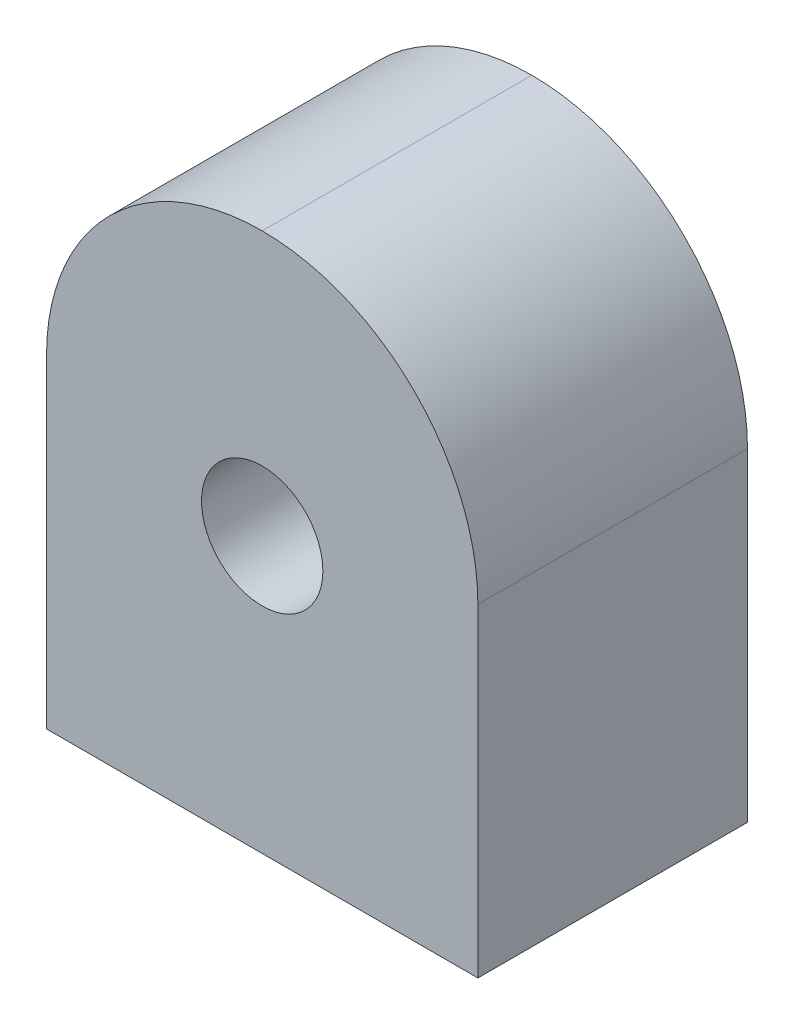
ISO-10303-21;
HEADER;
FILE_DESCRIPTION(('STEP AP214'),'2;1');
FILE_NAME('part.step','',(''),(''),'','','');
FILE_SCHEMA(('AUTOMOTIVE_DESIGN { 1 0 10303 214 1 1 1 1 }'));
ENDSEC;
DATA;
#1=APPLICATION_CONTEXT('core data for automotive mechanical design processes');
#2=APPLICATION_PROTOCOL_DEFINITION('international standard','automotive_design',2000,#1);
#3=PRODUCT_CONTEXT('',#1,'mechanical');
#4=PRODUCT('Part','Part','',(#3));
#5=PRODUCT_RELATED_PRODUCT_CATEGORY('part','',(#4));
#6=PRODUCT_DEFINITION_FORMATION('','',#4);
#7=PRODUCT_DEFINITION_CONTEXT('part definition',#1,'design');
#8=PRODUCT_DEFINITION('design','',#6,#7);
#9=PRODUCT_DEFINITION_SHAPE('','',#8);
#10=(LENGTH_UNIT() NAMED_UNIT(*) SI_UNIT(.MILLI.,.METRE.));
#11=(NAMED_UNIT(*) PLANE_ANGLE_UNIT() SI_UNIT($,.RADIAN.));
#12=(NAMED_UNIT(*) SI_UNIT($,.STERADIAN.) SOLID_ANGLE_UNIT());
#13=UNCERTAINTY_MEASURE_WITH_UNIT(LENGTH_MEASURE(1.E-05),#10,'distance_accuracy_value','');
#14=(GEOMETRIC_REPRESENTATION_CONTEXT(3) GLOBAL_UNCERTAINTY_ASSIGNED_CONTEXT((#13)) GLOBAL_UNIT_ASSIGNED_CONTEXT((#10,
#11,#12)) REPRESENTATION_CONTEXT('',''));
#15=CARTESIAN_POINT('',(0.,0.,0.));
#16=DIRECTION('',(0.,0.,1.));
#17=DIRECTION('',(1.,0.,0.));
#18=AXIS2_PLACEMENT_3D('',#15,#16,#17);
#19=CARTESIAN_POINT('',(0.,0.,10.));
#20=DIRECTION('',(1.,0.,0.));
#21=DIRECTION('',(0.,0.,-1.));
#22=AXIS2_PLACEMENT_3D('',#19,#20,#21);
#23=PLANE('',#22);
#24=DIRECTION('',(0.,-1.,0.));
#25=VECTOR('',#24,1.);
#26=CARTESIAN_POINT('',(0.,0.,10.));
#27=LINE('',#26,#25);
#28=CARTESIAN_POINT('',(0.,12.,10.));
#29=VERTEX_POINT('',#28);
#30=CARTESIAN_POINT('',(0.,0.,10.));
#31=VERTEX_POINT('',#30);
#32=EDGE_CURVE('E82',#29,#31,#27,.T.);
#33=ORIENTED_EDGE('',*,*,#32,.F.);
#34=DIRECTION('',(0.,0.,-1.));
#35=VECTOR('',#34,1.);
#36=CARTESIAN_POINT('',(0.,12.,10.));
#37=LINE('',#36,#35);
#38=CARTESIAN_POINT('',(0.,12.,0.));
#39=VERTEX_POINT('',#38);
#40=EDGE_CURVE('E11',#29,#39,#37,.T.);
#41=ORIENTED_EDGE('',*,*,#40,.T.);
#42=DIRECTION('',(0.,-1.,0.));
#43=VECTOR('',#42,1.);
#44=CARTESIAN_POINT('',(0.,0.,0.));
#45=LINE('',#44,#43);
#46=CARTESIAN_POINT('',(0.,0.,0.));
#47=VERTEX_POINT('',#46);
#48=EDGE_CURVE('E102',#39,#47,#45,.T.);
#49=ORIENTED_EDGE('',*,*,#48,.T.);
#50=DIRECTION('',(0.,0.,-1.));
#51=VECTOR('',#50,1.);
#52=CARTESIAN_POINT('',(0.,0.,10.));
#53=LINE('',#52,#51);
#54=EDGE_CURVE('E95',#31,#47,#53,.T.);
#55=ORIENTED_EDGE('',*,*,#54,.F.);
#56=EDGE_LOOP('',(#33,#41,#49,#55));
#57=FACE_BOUND('',#56,.T.);
#58=ADVANCED_FACE('F41',(#57),#23,.F.);
#59=CARTESIAN_POINT('',(0.,0.,10.));
#60=DIRECTION('',(0.,1.,0.));
#61=DIRECTION('',(0.,0.,1.));
#62=AXIS2_PLACEMENT_3D('',#59,#60,#61);
#63=PLANE('',#62);
#64=DIRECTION('',(1.,0.,0.));
#65=VECTOR('',#64,1.);
#66=CARTESIAN_POINT('',(0.,0.,0.));
#67=LINE('',#66,#65);
#68=CARTESIAN_POINT('',(16.,0.,0.));
#69=VERTEX_POINT('',#68);
#70=EDGE_CURVE('E126',#47,#69,#67,.T.);
#71=ORIENTED_EDGE('',*,*,#70,.T.);
#72=DIRECTION('',(0.,0.,-1.));
#73=VECTOR('',#72,1.);
#74=CARTESIAN_POINT('',(16.,0.,10.));
#75=LINE('',#74,#73);
#76=CARTESIAN_POINT('',(16.,0.,10.));
#77=VERTEX_POINT('',#76);
#78=EDGE_CURVE('E97',#77,#69,#75,.T.);
#79=ORIENTED_EDGE('',*,*,#78,.F.);
#80=DIRECTION('',(1.,0.,0.));
#81=VECTOR('',#80,1.);
#82=CARTESIAN_POINT('',(0.,0.,10.));
#83=LINE('',#82,#81);
#84=EDGE_CURVE('E85',#31,#77,#83,.T.);
#85=ORIENTED_EDGE('',*,*,#84,.F.);
#86=ORIENTED_EDGE('',*,*,#54,.T.);
#87=EDGE_LOOP('',(#71,#79,#85,#86));
#88=FACE_BOUND('',#87,.T.);
#89=ADVANCED_FACE('F94',(#88),#63,.F.);
#90=CARTESIAN_POINT('',(16.,0.,10.));
#91=DIRECTION('',(-1.,0.,0.));
#92=DIRECTION('',(0.,0.,1.));
#93=AXIS2_PLACEMENT_3D('',#90,#91,#92);
#94=PLANE('',#93);
#95=DIRECTION('',(0.,1.,0.));
#96=VECTOR('',#95,1.);
#97=CARTESIAN_POINT('',(16.,0.,0.));
#98=LINE('',#97,#96);
#99=CARTESIAN_POINT('',(16.,12.,0.));
#100=VERTEX_POINT('',#99);
#101=EDGE_CURVE('E90',#69,#100,#98,.T.);
#102=ORIENTED_EDGE('',*,*,#101,.T.);
#103=DIRECTION('',(0.,0.,-1.));
#104=VECTOR('',#103,1.);
#105=CARTESIAN_POINT('',(16.,12.,10.));
#106=LINE('',#105,#104);
#107=CARTESIAN_POINT('',(16.,12.,10.));
#108=VERTEX_POINT('',#107);
#109=EDGE_CURVE('E112',#100,#108,#106,.F.);
#110=ORIENTED_EDGE('',*,*,#109,.T.);
#111=DIRECTION('',(0.,1.,0.));
#112=VECTOR('',#111,1.);
#113=CARTESIAN_POINT('',(16.,0.,10.));
#114=LINE('',#113,#112);
#115=EDGE_CURVE('E99',#77,#108,#114,.T.);
#116=ORIENTED_EDGE('',*,*,#115,.F.);
#117=ORIENTED_EDGE('',*,*,#78,.T.);
#118=EDGE_LOOP('',(#102,#110,#116,#117));
#119=FACE_BOUND('',#118,.T.);
#120=ADVANCED_FACE('F119',(#119),#94,.F.);
#121=CARTESIAN_POINT('',(0.,0.,10.));
#122=DIRECTION('',(0.,0.,-1.));
#123=DIRECTION('',(-1.,0.,0.));
#124=AXIS2_PLACEMENT_3D('',#121,#122,#123);
#125=PLANE('',#124);
#126=CARTESIAN_POINT('',(8.,10.2,10.));
#127=DIRECTION('',(0.,0.,1.));
#128=DIRECTION('',(1.,0.,0.));
#129=AXIS2_PLACEMENT_3D('',#126,#127,#128);
#130=CIRCLE('',#129,2.25);
#131=CARTESIAN_POINT('',(10.25,10.2,10.));
#132=VERTEX_POINT('',#131);
#133=EDGE_CURVE('E135',#132,#132,#130,.T.);
#134=ORIENTED_EDGE('',*,*,#133,.F.);
#135=EDGE_LOOP('',(#134));
#136=FACE_BOUND('',#135,.T.);
#137=ORIENTED_EDGE('',*,*,#115,.T.);
#138=CARTESIAN_POINT('',(8.,12.,10.));
#139=DIRECTION('',(0.,0.,-1.));
#140=DIRECTION('',(-1.,0.,0.));
#141=AXIS2_PLACEMENT_3D('',#138,#139,#140);
#142=CIRCLE('',#141,8.);
#143=CARTESIAN_POINT('',(8.,20.,10.));
#144=VERTEX_POINT('',#143);
#145=EDGE_CURVE('E50',#108,#144,#142,.F.);
#146=ORIENTED_EDGE('',*,*,#145,.T.);
#147=CARTESIAN_POINT('',(8.,12.,10.));
#148=DIRECTION('',(0.,0.,-1.));
#149=DIRECTION('',(-1.,0.,0.));
#150=AXIS2_PLACEMENT_3D('',#147,#148,#149);
#151=CIRCLE('',#150,8.);
#152=EDGE_CURVE('E60',#144,#29,#151,.F.);
#153=ORIENTED_EDGE('',*,*,#152,.T.);
#154=ORIENTED_EDGE('',*,*,#32,.T.);
#155=ORIENTED_EDGE('',*,*,#84,.T.);
#156=EDGE_LOOP('',(#137,#146,#153,#154,#155));
#157=FACE_BOUND('',#156,.T.);
#158=ADVANCED_FACE('F84',(#136,#157),#125,.F.);
#159=CARTESIAN_POINT('',(0.,0.,0.));
#160=DIRECTION('',(0.,0.,-1.));
#161=DIRECTION('',(-1.,0.,0.));
#162=AXIS2_PLACEMENT_3D('',#159,#160,#161);
#163=PLANE('',#162);
#164=CARTESIAN_POINT('',(8.,10.2,0.));
#165=DIRECTION('',(0.,0.,1.));
#166=DIRECTION('',(1.,0.,0.));
#167=AXIS2_PLACEMENT_3D('',#164,#165,#166);
#168=CIRCLE('',#167,2.25);
#169=CARTESIAN_POINT('',(10.25,10.2,0.));
#170=VERTEX_POINT('',#169);
#171=EDGE_CURVE('E127',#170,#170,#168,.T.);
#172=ORIENTED_EDGE('',*,*,#171,.T.);
#173=EDGE_LOOP('',(#172));
#174=FACE_BOUND('',#173,.T.);
#175=CARTESIAN_POINT('',(8.,12.,0.));
#176=DIRECTION('',(0.,0.,-1.));
#177=DIRECTION('',(-1.,0.,0.));
#178=AXIS2_PLACEMENT_3D('',#175,#176,#177);
#179=CIRCLE('',#178,8.);
#180=CARTESIAN_POINT('',(8.,20.,0.));
#181=VERTEX_POINT('',#180);
#182=EDGE_CURVE('E104',#39,#181,#179,.T.);
#183=ORIENTED_EDGE('',*,*,#182,.T.);
#184=CARTESIAN_POINT('',(8.,12.,0.));
#185=DIRECTION('',(0.,0.,-1.));
#186=DIRECTION('',(-1.,0.,0.));
#187=AXIS2_PLACEMENT_3D('',#184,#185,#186);
#188=CIRCLE('',#187,8.);
#189=EDGE_CURVE('E106',#181,#100,#188,.T.);
#190=ORIENTED_EDGE('',*,*,#189,.T.);
#191=ORIENTED_EDGE('',*,*,#101,.F.);
#192=ORIENTED_EDGE('',*,*,#70,.F.);
#193=ORIENTED_EDGE('',*,*,#48,.F.);
#194=EDGE_LOOP('',(#183,#190,#191,#192,#193));
#195=FACE_BOUND('',#194,.T.);
#196=ADVANCED_FACE('F129',(#174,#195),#163,.T.);
#197=CARTESIAN_POINT('',(8.,10.2,0.));
#198=DIRECTION('',(0.,0.,1.));
#199=DIRECTION('',(1.,0.,0.));
#200=AXIS2_PLACEMENT_3D('',#197,#198,#199);
#201=CYLINDRICAL_SURFACE('',#200,2.25);
#202=ORIENTED_EDGE('',*,*,#171,.F.);
#203=EDGE_LOOP('',(#202));
#204=FACE_BOUND('',#203,.T.);
#205=ORIENTED_EDGE('',*,*,#133,.T.);
#206=EDGE_LOOP('',(#205));
#207=FACE_BOUND('',#206,.T.);
#208=ADVANCED_FACE('F145',(#204,#207),#201,.F.);
#209=CARTESIAN_POINT('',(8.,12.,10.));
#210=DIRECTION('',(0.,0.,-1.));
#211=DIRECTION('',(-1.,0.,0.));
#212=AXIS2_PLACEMENT_3D('',#209,#210,#211);
#213=CYLINDRICAL_SURFACE('',#212,8.);
#214=ORIENTED_EDGE('',*,*,#40,.F.);
#215=ORIENTED_EDGE('',*,*,#152,.F.);
#216=DIRECTION('',(0.,0.,-1.));
#217=VECTOR('',#216,1.);
#218=CARTESIAN_POINT('',(8.,20.,10.));
#219=LINE('',#218,#217);
#220=EDGE_CURVE('E45',#181,#144,#219,.F.);
#221=ORIENTED_EDGE('',*,*,#220,.F.);
#222=ORIENTED_EDGE('',*,*,#182,.F.);
#223=EDGE_LOOP('',(#214,#215,#221,#222));
#224=FACE_BOUND('',#223,.T.);
#225=ADVANCED_FACE('F43',(#224),#213,.T.);
#226=CARTESIAN_POINT('',(8.,12.,10.));
#227=DIRECTION('',(0.,0.,-1.));
#228=DIRECTION('',(-1.,0.,0.));
#229=AXIS2_PLACEMENT_3D('',#226,#227,#228);
#230=CYLINDRICAL_SURFACE('',#229,8.);
#231=ORIENTED_EDGE('',*,*,#145,.F.);
#232=ORIENTED_EDGE('',*,*,#109,.F.);
#233=ORIENTED_EDGE('',*,*,#189,.F.);
#234=ORIENTED_EDGE('',*,*,#220,.T.);
#235=EDGE_LOOP('',(#231,#232,#233,#234));
#236=FACE_BOUND('',#235,.T.);
#237=ADVANCED_FACE('F133',(#236),#230,.T.);
#238=CLOSED_SHELL('',(#58,#89,#120,#158,#196,#208,#225,#237));
#239=MANIFOLD_SOLID_BREP('B2',#238);
#240=ADVANCED_BREP_SHAPE_REPRESENTATION('',(#18,#239),#14);
#241=SHAPE_DEFINITION_REPRESENTATION(#9,#240);
ENDSEC;
END-ISO-10303-21;
